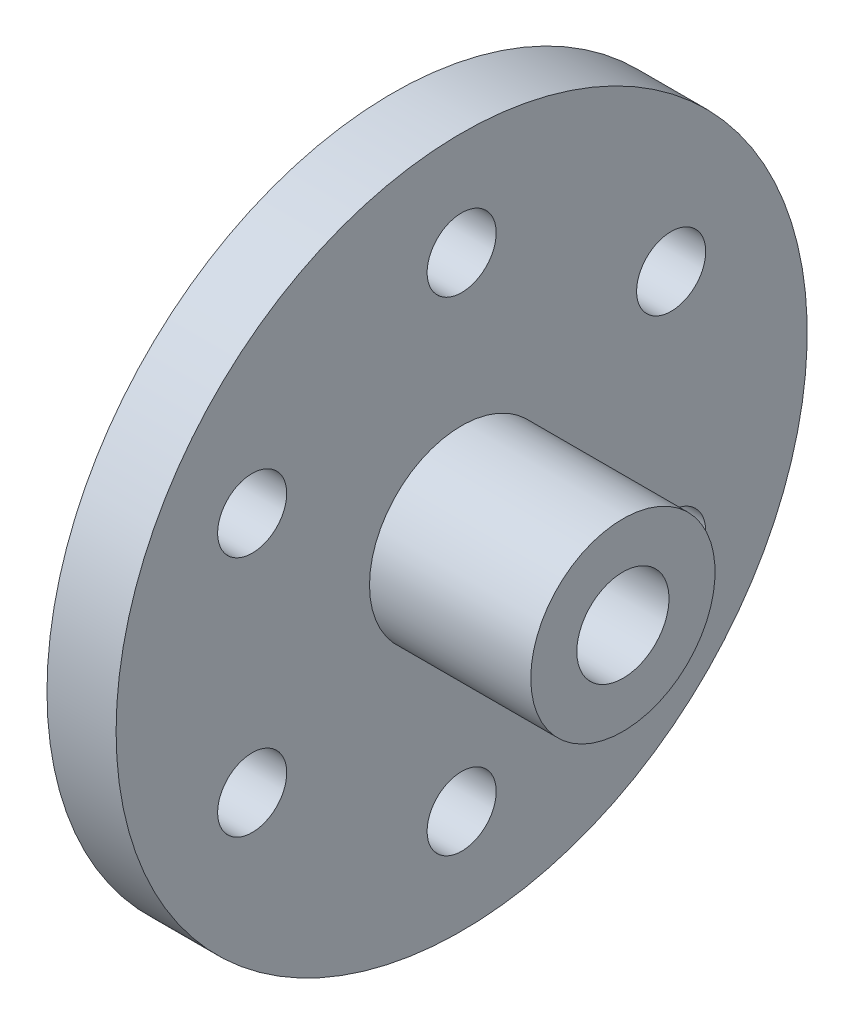
ISO-10303-21;
HEADER;
FILE_DESCRIPTION(('STEP AP214'),'2;1');
FILE_NAME('part.step','',(''),(''),'','','');
FILE_SCHEMA(('AUTOMOTIVE_DESIGN { 1 0 10303 214 1 1 1 1 }'));
ENDSEC;
DATA;
#1=APPLICATION_CONTEXT('core data for automotive mechanical design processes');
#2=APPLICATION_PROTOCOL_DEFINITION('international standard','automotive_design',2000,#1);
#3=PRODUCT_CONTEXT('',#1,'mechanical');
#4=PRODUCT('Part','Part','',(#3));
#5=PRODUCT_RELATED_PRODUCT_CATEGORY('part','',(#4));
#6=PRODUCT_DEFINITION_FORMATION('','',#4);
#7=PRODUCT_DEFINITION_CONTEXT('part definition',#1,'design');
#8=PRODUCT_DEFINITION('design','',#6,#7);
#9=PRODUCT_DEFINITION_SHAPE('','',#8);
#10=(LENGTH_UNIT() NAMED_UNIT(*) SI_UNIT(.MILLI.,.METRE.));
#11=(NAMED_UNIT(*) PLANE_ANGLE_UNIT() SI_UNIT($,.RADIAN.));
#12=(NAMED_UNIT(*) SI_UNIT($,.STERADIAN.) SOLID_ANGLE_UNIT());
#13=UNCERTAINTY_MEASURE_WITH_UNIT(LENGTH_MEASURE(1.E-05),#10,'distance_accuracy_value','');
#14=(GEOMETRIC_REPRESENTATION_CONTEXT(3) GLOBAL_UNCERTAINTY_ASSIGNED_CONTEXT((#13)) GLOBAL_UNIT_ASSIGNED_CONTEXT((#10,
#11,#12)) REPRESENTATION_CONTEXT('',''));
#15=CARTESIAN_POINT('',(0.,0.,0.));
#16=DIRECTION('',(0.,0.,1.));
#17=DIRECTION('',(1.,0.,0.));
#18=AXIS2_PLACEMENT_3D('',#15,#16,#17);
#19=CARTESIAN_POINT('',(0.,0.,0.));
#20=DIRECTION('',(-1.,0.,0.));
#21=DIRECTION('',(0.,0.,1.));
#22=AXIS2_PLACEMENT_3D('',#19,#20,#21);
#23=CYLINDRICAL_SURFACE('',#22,15.);
#24=CARTESIAN_POINT('',(0.,0.,0.));
#25=DIRECTION('',(-1.,0.,0.));
#26=DIRECTION('',(0.,0.,1.));
#27=AXIS2_PLACEMENT_3D('',#24,#25,#26);
#28=CIRCLE('',#27,15.);
#29=CARTESIAN_POINT('',(0.,0.,15.));
#30=VERTEX_POINT('',#29);
#31=EDGE_CURVE('E10',#30,#30,#28,.T.);
#32=ORIENTED_EDGE('',*,*,#31,.F.);
#33=EDGE_LOOP('',(#32));
#34=FACE_BOUND('',#33,.T.);
#35=CARTESIAN_POINT('',(3.,0.,0.));
#36=DIRECTION('',(-1.,0.,0.));
#37=DIRECTION('',(0.,0.,1.));
#38=AXIS2_PLACEMENT_3D('',#35,#36,#37);
#39=CIRCLE('',#38,15.);
#40=CARTESIAN_POINT('',(3.,0.,15.));
#41=VERTEX_POINT('',#40);
#42=EDGE_CURVE('E65',#41,#41,#39,.T.);
#43=ORIENTED_EDGE('',*,*,#42,.T.);
#44=EDGE_LOOP('',(#43));
#45=FACE_BOUND('',#44,.T.);
#46=ADVANCED_FACE('F32',(#34,#45),#23,.T.);
#47=CARTESIAN_POINT('',(0.,15.,0.));
#48=DIRECTION('',(1.,0.,0.));
#49=DIRECTION('',(0.,0.,-1.));
#50=AXIS2_PLACEMENT_3D('',#47,#48,#49);
#51=PLANE('',#50);
#52=CARTESIAN_POINT('',(0.,10.5,0.));
#53=DIRECTION('',(-1.,0.,0.));
#54=DIRECTION('',(0.,0.,1.));
#55=AXIS2_PLACEMENT_3D('',#52,#53,#54);
#56=CIRCLE('',#55,1.5);
#57=CARTESIAN_POINT('',(0.,10.5,1.5));
#58=VERTEX_POINT('',#57);
#59=EDGE_CURVE('E52',#58,#58,#56,.T.);
#60=ORIENTED_EDGE('',*,*,#59,.F.);
#61=EDGE_LOOP('',(#60));
#62=FACE_BOUND('',#61,.T.);
#63=CARTESIAN_POINT('',(0.,5.2499999999997,-9.09326673973644));
#64=DIRECTION('',(-1.,0.,0.));
#65=DIRECTION('',(0.,0.,1.));
#66=AXIS2_PLACEMENT_3D('',#63,#64,#65);
#67=CIRCLE('',#66,1.5);
#68=CARTESIAN_POINT('',(0.,5.2499999999997,-7.59326673973644));
#69=VERTEX_POINT('',#68);
#70=EDGE_CURVE('E145',#69,#69,#67,.T.);
#71=ORIENTED_EDGE('',*,*,#70,.F.);
#72=EDGE_LOOP('',(#71));
#73=FACE_BOUND('',#72,.T.);
#74=CARTESIAN_POINT('',(0.,-5.2500000000003,-9.09326673973609));
#75=DIRECTION('',(-1.,0.,0.));
#76=DIRECTION('',(0.,0.,1.));
#77=AXIS2_PLACEMENT_3D('',#74,#75,#76);
#78=CIRCLE('',#77,1.5);
#79=CARTESIAN_POINT('',(0.,-5.2500000000003,-7.59326673973609));
#80=VERTEX_POINT('',#79);
#81=EDGE_CURVE('E77',#80,#80,#78,.T.);
#82=ORIENTED_EDGE('',*,*,#81,.F.);
#83=EDGE_LOOP('',(#82));
#84=FACE_BOUND('',#83,.T.);
#85=CARTESIAN_POINT('',(0.,-10.5,6.81202541230336E-13));
#86=DIRECTION('',(-1.,0.,0.));
#87=DIRECTION('',(0.,0.,1.));
#88=AXIS2_PLACEMENT_3D('',#85,#86,#87);
#89=CIRCLE('',#88,1.5);
#90=CARTESIAN_POINT('',(0.,-10.5,1.50000000000068));
#91=VERTEX_POINT('',#90);
#92=EDGE_CURVE('E149',#91,#91,#89,.T.);
#93=ORIENTED_EDGE('',*,*,#92,.F.);
#94=EDGE_LOOP('',(#93));
#95=FACE_BOUND('',#94,.T.);
#96=CARTESIAN_POINT('',(0.,-5.2499999999997,9.09326673973712));
#97=DIRECTION('',(-1.,0.,0.));
#98=DIRECTION('',(0.,0.,1.));
#99=AXIS2_PLACEMENT_3D('',#96,#97,#98);
#100=CIRCLE('',#99,1.5);
#101=CARTESIAN_POINT('',(0.,-5.2499999999997,10.5932667397371));
#102=VERTEX_POINT('',#101);
#103=EDGE_CURVE('E142',#102,#102,#100,.T.);
#104=ORIENTED_EDGE('',*,*,#103,.F.);
#105=EDGE_LOOP('',(#104));
#106=FACE_BOUND('',#105,.T.);
#107=CARTESIAN_POINT('',(0.,5.2500000000003,9.09326673973678));
#108=DIRECTION('',(-1.,0.,0.));
#109=DIRECTION('',(0.,0.,1.));
#110=AXIS2_PLACEMENT_3D('',#107,#108,#109);
#111=CIRCLE('',#110,1.5);
#112=CARTESIAN_POINT('',(0.,5.2500000000003,10.5932667397368));
#113=VERTEX_POINT('',#112);
#114=EDGE_CURVE('E139',#113,#113,#111,.T.);
#115=ORIENTED_EDGE('',*,*,#114,.F.);
#116=EDGE_LOOP('',(#115));
#117=FACE_BOUND('',#116,.T.);
#118=CARTESIAN_POINT('',(0.,0.,0.));
#119=DIRECTION('',(-1.,0.,0.));
#120=DIRECTION('',(0.,0.,1.));
#121=AXIS2_PLACEMENT_3D('',#118,#119,#120);
#122=CIRCLE('',#121,2.);
#123=CARTESIAN_POINT('',(0.,0.,2.));
#124=VERTEX_POINT('',#123);
#125=EDGE_CURVE('E39',#124,#124,#122,.T.);
#126=ORIENTED_EDGE('',*,*,#125,.F.);
#127=EDGE_LOOP('',(#126));
#128=FACE_BOUND('',#127,.T.);
#129=ORIENTED_EDGE('',*,*,#31,.T.);
#130=EDGE_LOOP('',(#129));
#131=FACE_BOUND('',#130,.T.);
#132=ADVANCED_FACE('F89',(#62,#73,#84,#95,#106,#117,#128,#131),#51,.F.);
#133=CARTESIAN_POINT('',(0.,0.,0.));
#134=DIRECTION('',(-1.,0.,0.));
#135=DIRECTION('',(0.,0.,1.));
#136=AXIS2_PLACEMENT_3D('',#133,#134,#135);
#137=CYLINDRICAL_SURFACE('',#136,2.);
#138=CARTESIAN_POINT('',(10.,0.,0.));
#139=DIRECTION('',(-1.,0.,0.));
#140=DIRECTION('',(0.,0.,1.));
#141=AXIS2_PLACEMENT_3D('',#138,#139,#140);
#142=CIRCLE('',#141,2.);
#143=CARTESIAN_POINT('',(10.,0.,2.));
#144=VERTEX_POINT('',#143);
#145=EDGE_CURVE('E44',#144,#144,#142,.T.);
#146=ORIENTED_EDGE('',*,*,#145,.F.);
#147=EDGE_LOOP('',(#146));
#148=FACE_BOUND('',#147,.T.);
#149=ORIENTED_EDGE('',*,*,#125,.T.);
#150=EDGE_LOOP('',(#149));
#151=FACE_BOUND('',#150,.T.);
#152=ADVANCED_FACE('F86',(#148,#151),#137,.F.);
#153=CARTESIAN_POINT('',(10.,2.,0.));
#154=DIRECTION('',(-1.,0.,0.));
#155=DIRECTION('',(0.,0.,1.));
#156=AXIS2_PLACEMENT_3D('',#153,#154,#155);
#157=PLANE('',#156);
#158=CARTESIAN_POINT('',(10.,0.,0.));
#159=DIRECTION('',(-1.,0.,0.));
#160=DIRECTION('',(0.,0.,1.));
#161=AXIS2_PLACEMENT_3D('',#158,#159,#160);
#162=CIRCLE('',#161,4.);
#163=CARTESIAN_POINT('',(10.,0.,4.));
#164=VERTEX_POINT('',#163);
#165=EDGE_CURVE('E74',#164,#164,#162,.T.);
#166=ORIENTED_EDGE('',*,*,#165,.F.);
#167=EDGE_LOOP('',(#166));
#168=FACE_BOUND('',#167,.T.);
#169=ORIENTED_EDGE('',*,*,#145,.T.);
#170=EDGE_LOOP('',(#169));
#171=FACE_BOUND('',#170,.T.);
#172=ADVANCED_FACE('F84',(#168,#171),#157,.F.);
#173=CARTESIAN_POINT('',(0.,0.,0.));
#174=DIRECTION('',(-1.,0.,0.));
#175=DIRECTION('',(0.,0.,1.));
#176=AXIS2_PLACEMENT_3D('',#173,#174,#175);
#177=CYLINDRICAL_SURFACE('',#176,4.);
#178=CARTESIAN_POINT('',(3.,0.,0.));
#179=DIRECTION('',(-1.,0.,0.));
#180=DIRECTION('',(0.,0.,1.));
#181=AXIS2_PLACEMENT_3D('',#178,#179,#180);
#182=CIRCLE('',#181,4.);
#183=CARTESIAN_POINT('',(3.,0.,4.));
#184=VERTEX_POINT('',#183);
#185=EDGE_CURVE('E69',#184,#184,#182,.T.);
#186=ORIENTED_EDGE('',*,*,#185,.F.);
#187=EDGE_LOOP('',(#186));
#188=FACE_BOUND('',#187,.T.);
#189=ORIENTED_EDGE('',*,*,#165,.T.);
#190=EDGE_LOOP('',(#189));
#191=FACE_BOUND('',#190,.T.);
#192=ADVANCED_FACE('F104',(#188,#191),#177,.T.);
#193=CARTESIAN_POINT('',(3.,4.,0.));
#194=DIRECTION('',(-1.,0.,0.));
#195=DIRECTION('',(0.,0.,1.));
#196=AXIS2_PLACEMENT_3D('',#193,#194,#195);
#197=PLANE('',#196);
#198=CARTESIAN_POINT('',(3.,10.5,0.));
#199=DIRECTION('',(-1.,0.,0.));
#200=DIRECTION('',(0.,0.,1.));
#201=AXIS2_PLACEMENT_3D('',#198,#199,#200);
#202=CIRCLE('',#201,1.5);
#203=CARTESIAN_POINT('',(3.,10.5,1.5));
#204=VERTEX_POINT('',#203);
#205=EDGE_CURVE('E35',#204,#204,#202,.T.);
#206=ORIENTED_EDGE('',*,*,#205,.T.);
#207=EDGE_LOOP('',(#206));
#208=FACE_BOUND('',#207,.T.);
#209=CARTESIAN_POINT('',(3.,5.2499999999997,-9.09326673973644));
#210=DIRECTION('',(-1.,0.,0.));
#211=DIRECTION('',(0.,0.,1.));
#212=AXIS2_PLACEMENT_3D('',#209,#210,#211);
#213=CIRCLE('',#212,1.5);
#214=CARTESIAN_POINT('',(3.,5.2499999999997,-7.59326673973644));
#215=VERTEX_POINT('',#214);
#216=EDGE_CURVE('E60',#215,#215,#213,.T.);
#217=ORIENTED_EDGE('',*,*,#216,.T.);
#218=EDGE_LOOP('',(#217));
#219=FACE_BOUND('',#218,.T.);
#220=CARTESIAN_POINT('',(3.,-5.2500000000003,-9.09326673973609));
#221=DIRECTION('',(-1.,0.,0.));
#222=DIRECTION('',(0.,0.,1.));
#223=AXIS2_PLACEMENT_3D('',#220,#221,#222);
#224=CIRCLE('',#223,1.5);
#225=CARTESIAN_POINT('',(3.,-5.2500000000003,-7.59326673973609));
#226=VERTEX_POINT('',#225);
#227=EDGE_CURVE('E58',#226,#226,#224,.T.);
#228=ORIENTED_EDGE('',*,*,#227,.T.);
#229=EDGE_LOOP('',(#228));
#230=FACE_BOUND('',#229,.T.);
#231=CARTESIAN_POINT('',(3.,-10.5,6.81202541230336E-13));
#232=DIRECTION('',(-1.,0.,0.));
#233=DIRECTION('',(0.,0.,1.));
#234=AXIS2_PLACEMENT_3D('',#231,#232,#233);
#235=CIRCLE('',#234,1.5);
#236=CARTESIAN_POINT('',(3.,-10.5,1.50000000000068));
#237=VERTEX_POINT('',#236);
#238=EDGE_CURVE('E55',#237,#237,#235,.T.);
#239=ORIENTED_EDGE('',*,*,#238,.T.);
#240=EDGE_LOOP('',(#239));
#241=FACE_BOUND('',#240,.T.);
#242=CARTESIAN_POINT('',(3.,-5.2499999999997,9.09326673973712));
#243=DIRECTION('',(-1.,0.,0.));
#244=DIRECTION('',(0.,0.,1.));
#245=AXIS2_PLACEMENT_3D('',#242,#243,#244);
#246=CIRCLE('',#245,1.5);
#247=CARTESIAN_POINT('',(3.,-5.2499999999997,10.5932667397371));
#248=VERTEX_POINT('',#247);
#249=EDGE_CURVE('E51',#248,#248,#246,.T.);
#250=ORIENTED_EDGE('',*,*,#249,.T.);
#251=EDGE_LOOP('',(#250));
#252=FACE_BOUND('',#251,.T.);
#253=CARTESIAN_POINT('',(3.,5.2500000000003,9.09326673973678));
#254=DIRECTION('',(-1.,0.,0.));
#255=DIRECTION('',(0.,0.,1.));
#256=AXIS2_PLACEMENT_3D('',#253,#254,#255);
#257=CIRCLE('',#256,1.5);
#258=CARTESIAN_POINT('',(3.,5.2500000000003,10.5932667397368));
#259=VERTEX_POINT('',#258);
#260=EDGE_CURVE('E48',#259,#259,#257,.T.);
#261=ORIENTED_EDGE('',*,*,#260,.T.);
#262=EDGE_LOOP('',(#261));
#263=FACE_BOUND('',#262,.T.);
#264=ORIENTED_EDGE('',*,*,#42,.F.);
#265=EDGE_LOOP('',(#264));
#266=FACE_BOUND('',#265,.T.);
#267=ORIENTED_EDGE('',*,*,#185,.T.);
#268=EDGE_LOOP('',(#267));
#269=FACE_BOUND('',#268,.T.);
#270=ADVANCED_FACE('F108',(#208,#219,#230,#241,#252,#263,#266,#269),#197,.F.);
#271=CARTESIAN_POINT('',(10.,5.2500000000003,9.09326673973678));
#272=DIRECTION('',(-1.,0.,0.));
#273=DIRECTION('',(0.,0.,1.));
#274=AXIS2_PLACEMENT_3D('',#271,#272,#273);
#275=CYLINDRICAL_SURFACE('',#274,1.5);
#276=ORIENTED_EDGE('',*,*,#114,.T.);
#277=EDGE_LOOP('',(#276));
#278=FACE_BOUND('',#277,.T.);
#279=ORIENTED_EDGE('',*,*,#260,.F.);
#280=EDGE_LOOP('',(#279));
#281=FACE_BOUND('',#280,.T.);
#282=ADVANCED_FACE('F112',(#278,#281),#275,.F.);
#283=CARTESIAN_POINT('',(10.,-5.2499999999997,9.09326673973712));
#284=DIRECTION('',(-1.,0.,0.));
#285=DIRECTION('',(0.,0.,1.));
#286=AXIS2_PLACEMENT_3D('',#283,#284,#285);
#287=CYLINDRICAL_SURFACE('',#286,1.5);
#288=ORIENTED_EDGE('',*,*,#103,.T.);
#289=EDGE_LOOP('',(#288));
#290=FACE_BOUND('',#289,.T.);
#291=ORIENTED_EDGE('',*,*,#249,.F.);
#292=EDGE_LOOP('',(#291));
#293=FACE_BOUND('',#292,.T.);
#294=ADVANCED_FACE('F121',(#290,#293),#287,.F.);
#295=CARTESIAN_POINT('',(10.,-10.5,6.81202541230336E-13));
#296=DIRECTION('',(-1.,0.,0.));
#297=DIRECTION('',(0.,0.,1.));
#298=AXIS2_PLACEMENT_3D('',#295,#296,#297);
#299=CYLINDRICAL_SURFACE('',#298,1.5);
#300=ORIENTED_EDGE('',*,*,#92,.T.);
#301=EDGE_LOOP('',(#300));
#302=FACE_BOUND('',#301,.T.);
#303=ORIENTED_EDGE('',*,*,#238,.F.);
#304=EDGE_LOOP('',(#303));
#305=FACE_BOUND('',#304,.T.);
#306=ADVANCED_FACE('F117',(#302,#305),#299,.F.);
#307=CARTESIAN_POINT('',(10.,-5.2500000000003,-9.09326673973609));
#308=DIRECTION('',(-1.,0.,0.));
#309=DIRECTION('',(0.,0.,1.));
#310=AXIS2_PLACEMENT_3D('',#307,#308,#309);
#311=CYLINDRICAL_SURFACE('',#310,1.5);
#312=ORIENTED_EDGE('',*,*,#81,.T.);
#313=EDGE_LOOP('',(#312));
#314=FACE_BOUND('',#313,.T.);
#315=ORIENTED_EDGE('',*,*,#227,.F.);
#316=EDGE_LOOP('',(#315));
#317=FACE_BOUND('',#316,.T.);
#318=ADVANCED_FACE('F113',(#314,#317),#311,.F.);
#319=CARTESIAN_POINT('',(10.,5.2499999999997,-9.09326673973644));
#320=DIRECTION('',(-1.,0.,0.));
#321=DIRECTION('',(0.,0.,1.));
#322=AXIS2_PLACEMENT_3D('',#319,#320,#321);
#323=CYLINDRICAL_SURFACE('',#322,1.5);
#324=ORIENTED_EDGE('',*,*,#70,.T.);
#325=EDGE_LOOP('',(#324));
#326=FACE_BOUND('',#325,.T.);
#327=ORIENTED_EDGE('',*,*,#216,.F.);
#328=EDGE_LOOP('',(#327));
#329=FACE_BOUND('',#328,.T.);
#330=ADVANCED_FACE('F116',(#326,#329),#323,.F.);
#331=CARTESIAN_POINT('',(10.,10.5,0.));
#332=DIRECTION('',(-1.,0.,0.));
#333=DIRECTION('',(0.,0.,1.));
#334=AXIS2_PLACEMENT_3D('',#331,#332,#333);
#335=CYLINDRICAL_SURFACE('',#334,1.5);
#336=ORIENTED_EDGE('',*,*,#59,.T.);
#337=EDGE_LOOP('',(#336));
#338=FACE_BOUND('',#337,.T.);
#339=ORIENTED_EDGE('',*,*,#205,.F.);
#340=EDGE_LOOP('',(#339));
#341=FACE_BOUND('',#340,.T.);
#342=ADVANCED_FACE('F131',(#338,#341),#335,.F.);
#343=CLOSED_SHELL('',(#46,#132,#152,#172,#192,#270,#282,#294,#306,#318,#330,#342));
#344=MANIFOLD_SOLID_BREP('B2',#343);
#345=ADVANCED_BREP_SHAPE_REPRESENTATION('',(#18,#344),#14);
#346=SHAPE_DEFINITION_REPRESENTATION(#9,#345);
ENDSEC;
END-ISO-10303-21;
